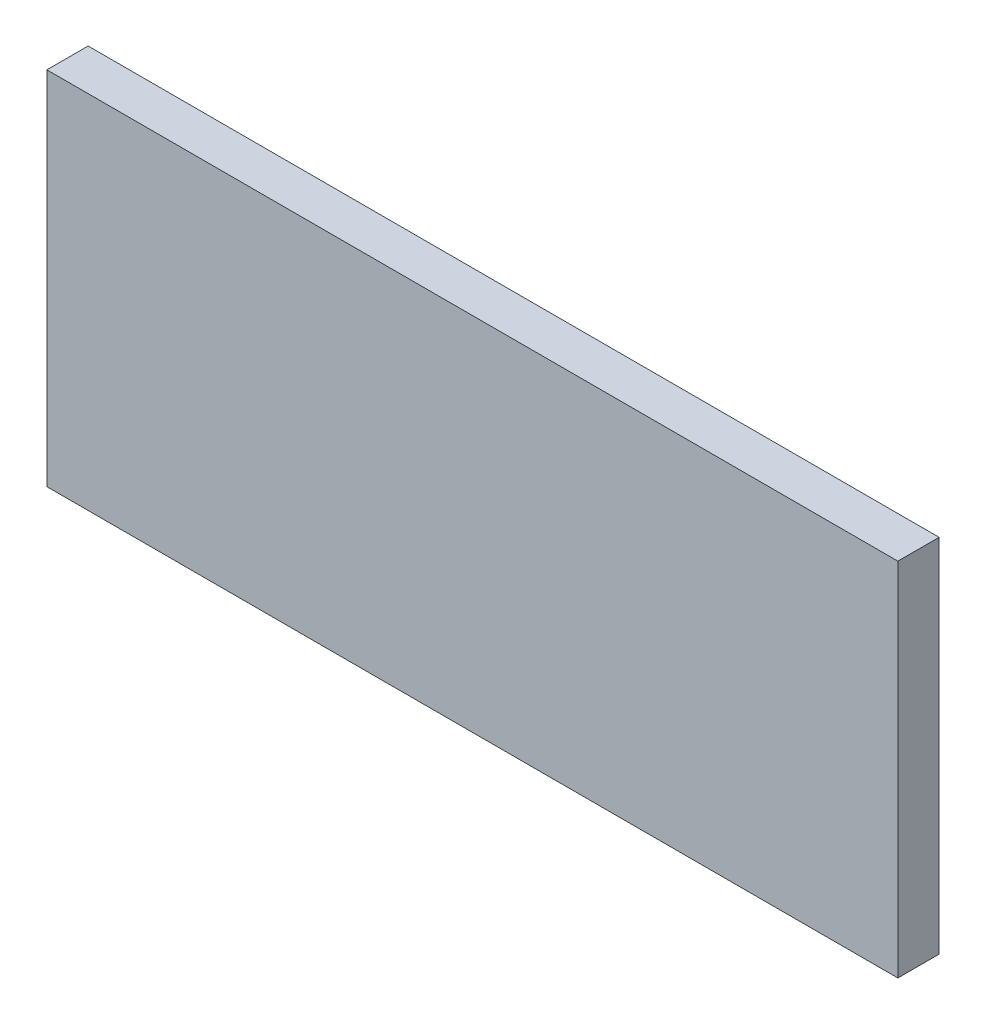
ISO-10303-21;
HEADER;
FILE_DESCRIPTION(('STEP AP214'),'2;1');
FILE_NAME('part.step','',(''),(''),'','','');
FILE_SCHEMA(('AUTOMOTIVE_DESIGN { 1 0 10303 214 1 1 1 1 }'));
ENDSEC;
DATA;
#1=APPLICATION_CONTEXT('core data for automotive mechanical design processes');
#2=APPLICATION_PROTOCOL_DEFINITION('international standard','automotive_design',2000,#1);
#3=PRODUCT_CONTEXT('',#1,'mechanical');
#4=PRODUCT('Part','Part','',(#3));
#5=PRODUCT_RELATED_PRODUCT_CATEGORY('part','',(#4));
#6=PRODUCT_DEFINITION_FORMATION('','',#4);
#7=PRODUCT_DEFINITION_CONTEXT('part definition',#1,'design');
#8=PRODUCT_DEFINITION('design','',#6,#7);
#9=PRODUCT_DEFINITION_SHAPE('','',#8);
#10=(LENGTH_UNIT() NAMED_UNIT(*) SI_UNIT(.MILLI.,.METRE.));
#11=(NAMED_UNIT(*) PLANE_ANGLE_UNIT() SI_UNIT($,.RADIAN.));
#12=(NAMED_UNIT(*) SI_UNIT($,.STERADIAN.) SOLID_ANGLE_UNIT());
#13=UNCERTAINTY_MEASURE_WITH_UNIT(LENGTH_MEASURE(1.E-05),#10,'distance_accuracy_value','');
#14=(GEOMETRIC_REPRESENTATION_CONTEXT(3) GLOBAL_UNCERTAINTY_ASSIGNED_CONTEXT((#13)) GLOBAL_UNIT_ASSIGNED_CONTEXT((#10,
#11,#12)) REPRESENTATION_CONTEXT('',''));
#15=CARTESIAN_POINT('',(0.,0.,0.));
#16=DIRECTION('',(0.,0.,1.));
#17=DIRECTION('',(1.,0.,0.));
#18=AXIS2_PLACEMENT_3D('',#15,#16,#17);
#19=CARTESIAN_POINT('',(-165.,-70.,16.));
#20=DIRECTION('',(1.,0.,0.));
#21=DIRECTION('',(0.,0.,-1.));
#22=AXIS2_PLACEMENT_3D('',#19,#20,#21);
#23=PLANE('',#22);
#24=DIRECTION('',(0.,-1.,0.));
#25=VECTOR('',#24,1.);
#26=CARTESIAN_POINT('',(-165.,-70.,0.));
#27=LINE('',#26,#25);
#28=CARTESIAN_POINT('',(-165.,70.,0.));
#29=VERTEX_POINT('',#28);
#30=CARTESIAN_POINT('',(-165.,-70.,0.));
#31=VERTEX_POINT('',#30);
#32=EDGE_CURVE('E98',#29,#31,#27,.T.);
#33=ORIENTED_EDGE('',*,*,#32,.T.);
#34=DIRECTION('',(0.,0.,-1.));
#35=VECTOR('',#34,1.);
#36=CARTESIAN_POINT('',(-165.,-70.,16.));
#37=LINE('',#36,#35);
#38=CARTESIAN_POINT('',(-165.,-70.,16.));
#39=VERTEX_POINT('',#38);
#40=EDGE_CURVE('E11',#39,#31,#37,.T.);
#41=ORIENTED_EDGE('',*,*,#40,.F.);
#42=DIRECTION('',(0.,-1.,0.));
#43=VECTOR('',#42,1.);
#44=CARTESIAN_POINT('',(-165.,-70.,16.));
#45=LINE('',#44,#43);
#46=CARTESIAN_POINT('',(-165.,70.,16.));
#47=VERTEX_POINT('',#46);
#48=EDGE_CURVE('E86',#47,#39,#45,.T.);
#49=ORIENTED_EDGE('',*,*,#48,.F.);
#50=DIRECTION('',(0.,0.,-1.));
#51=VECTOR('',#50,1.);
#52=CARTESIAN_POINT('',(-165.,70.,16.));
#53=LINE('',#52,#51);
#54=EDGE_CURVE('E94',#47,#29,#53,.T.);
#55=ORIENTED_EDGE('',*,*,#54,.T.);
#56=EDGE_LOOP('',(#33,#41,#49,#55));
#57=FACE_BOUND('',#56,.T.);
#58=ADVANCED_FACE('F35',(#57),#23,.F.);
#59=CARTESIAN_POINT('',(165.,-70.,16.));
#60=DIRECTION('',(0.,1.,0.));
#61=DIRECTION('',(-1.,0.,0.));
#62=AXIS2_PLACEMENT_3D('',#59,#60,#61);
#63=PLANE('',#62);
#64=DIRECTION('',(1.,0.,0.));
#65=VECTOR('',#64,1.);
#66=CARTESIAN_POINT('',(165.,-70.,0.));
#67=LINE('',#66,#65);
#68=CARTESIAN_POINT('',(165.,-70.,0.));
#69=VERTEX_POINT('',#68);
#70=EDGE_CURVE('E90',#31,#69,#67,.T.);
#71=ORIENTED_EDGE('',*,*,#70,.T.);
#72=DIRECTION('',(0.,0.,-1.));
#73=VECTOR('',#72,1.);
#74=CARTESIAN_POINT('',(165.,-70.,16.));
#75=LINE('',#74,#73);
#76=CARTESIAN_POINT('',(165.,-70.,16.));
#77=VERTEX_POINT('',#76);
#78=EDGE_CURVE('E43',#77,#69,#75,.T.);
#79=ORIENTED_EDGE('',*,*,#78,.F.);
#80=DIRECTION('',(1.,0.,0.));
#81=VECTOR('',#80,1.);
#82=CARTESIAN_POINT('',(165.,-70.,16.));
#83=LINE('',#82,#81);
#84=EDGE_CURVE('E81',#39,#77,#83,.T.);
#85=ORIENTED_EDGE('',*,*,#84,.F.);
#86=ORIENTED_EDGE('',*,*,#40,.T.);
#87=EDGE_LOOP('',(#71,#79,#85,#86));
#88=FACE_BOUND('',#87,.T.);
#89=ADVANCED_FACE('F89',(#88),#63,.F.);
#90=CARTESIAN_POINT('',(165.,-70.,16.));
#91=DIRECTION('',(-1.,0.,0.));
#92=DIRECTION('',(0.,0.,1.));
#93=AXIS2_PLACEMENT_3D('',#90,#91,#92);
#94=PLANE('',#93);
#95=DIRECTION('',(0.,1.,0.));
#96=VECTOR('',#95,1.);
#97=CARTESIAN_POINT('',(165.,-70.,0.));
#98=LINE('',#97,#96);
#99=CARTESIAN_POINT('',(165.,70.,0.));
#100=VERTEX_POINT('',#99);
#101=EDGE_CURVE('E68',#69,#100,#98,.T.);
#102=ORIENTED_EDGE('',*,*,#101,.T.);
#103=DIRECTION('',(0.,0.,-1.));
#104=VECTOR('',#103,1.);
#105=CARTESIAN_POINT('',(165.,70.,16.));
#106=LINE('',#105,#104);
#107=CARTESIAN_POINT('',(165.,70.,16.));
#108=VERTEX_POINT('',#107);
#109=EDGE_CURVE('E91',#108,#100,#106,.T.);
#110=ORIENTED_EDGE('',*,*,#109,.F.);
#111=DIRECTION('',(0.,1.,0.));
#112=VECTOR('',#111,1.);
#113=CARTESIAN_POINT('',(165.,-70.,16.));
#114=LINE('',#113,#112);
#115=EDGE_CURVE('E84',#77,#108,#114,.T.);
#116=ORIENTED_EDGE('',*,*,#115,.F.);
#117=ORIENTED_EDGE('',*,*,#78,.T.);
#118=EDGE_LOOP('',(#102,#110,#116,#117));
#119=FACE_BOUND('',#118,.T.);
#120=ADVANCED_FACE('F92',(#119),#94,.F.);
#121=CARTESIAN_POINT('',(165.,70.,16.));
#122=DIRECTION('',(0.,-1.,0.));
#123=DIRECTION('',(0.,0.,-1.));
#124=AXIS2_PLACEMENT_3D('',#121,#122,#123);
#125=PLANE('',#124);
#126=DIRECTION('',(-1.,0.,0.));
#127=VECTOR('',#126,1.);
#128=CARTESIAN_POINT('',(165.,70.,0.));
#129=LINE('',#128,#127);
#130=EDGE_CURVE('E74',#100,#29,#129,.T.);
#131=ORIENTED_EDGE('',*,*,#130,.T.);
#132=ORIENTED_EDGE('',*,*,#54,.F.);
#133=DIRECTION('',(-1.,0.,0.));
#134=VECTOR('',#133,1.);
#135=CARTESIAN_POINT('',(165.,70.,16.));
#136=LINE('',#135,#134);
#137=EDGE_CURVE('E51',#108,#47,#136,.T.);
#138=ORIENTED_EDGE('',*,*,#137,.F.);
#139=ORIENTED_EDGE('',*,*,#109,.T.);
#140=EDGE_LOOP('',(#131,#132,#138,#139));
#141=FACE_BOUND('',#140,.T.);
#142=ADVANCED_FACE('F105',(#141),#125,.F.);
#143=CARTESIAN_POINT('',(0.,0.,16.));
#144=DIRECTION('',(0.,0.,1.));
#145=DIRECTION('',(1.,0.,0.));
#146=AXIS2_PLACEMENT_3D('',#143,#144,#145);
#147=PLANE('',#146);
#148=ORIENTED_EDGE('',*,*,#48,.T.);
#149=ORIENTED_EDGE('',*,*,#84,.T.);
#150=ORIENTED_EDGE('',*,*,#115,.T.);
#151=ORIENTED_EDGE('',*,*,#137,.T.);
#152=EDGE_LOOP('',(#148,#149,#150,#151));
#153=FACE_BOUND('',#152,.T.);
#154=ADVANCED_FACE('F82',(#153),#147,.T.);
#155=CARTESIAN_POINT('',(0.,0.,0.));
#156=DIRECTION('',(0.,0.,1.));
#157=DIRECTION('',(1.,0.,0.));
#158=AXIS2_PLACEMENT_3D('',#155,#156,#157);
#159=PLANE('',#158);
#160=ORIENTED_EDGE('',*,*,#32,.F.);
#161=ORIENTED_EDGE('',*,*,#130,.F.);
#162=ORIENTED_EDGE('',*,*,#101,.F.);
#163=ORIENTED_EDGE('',*,*,#70,.F.);
#164=EDGE_LOOP('',(#160,#161,#162,#163));
#165=FACE_BOUND('',#164,.T.);
#166=ADVANCED_FACE('F108',(#165),#159,.F.);
#167=CLOSED_SHELL('',(#58,#89,#120,#142,#154,#166));
#168=MANIFOLD_SOLID_BREP('B2',#167);
#169=ADVANCED_BREP_SHAPE_REPRESENTATION('',(#18,#168),#14);
#170=SHAPE_DEFINITION_REPRESENTATION(#9,#169);
ENDSEC;
END-ISO-10303-21;
